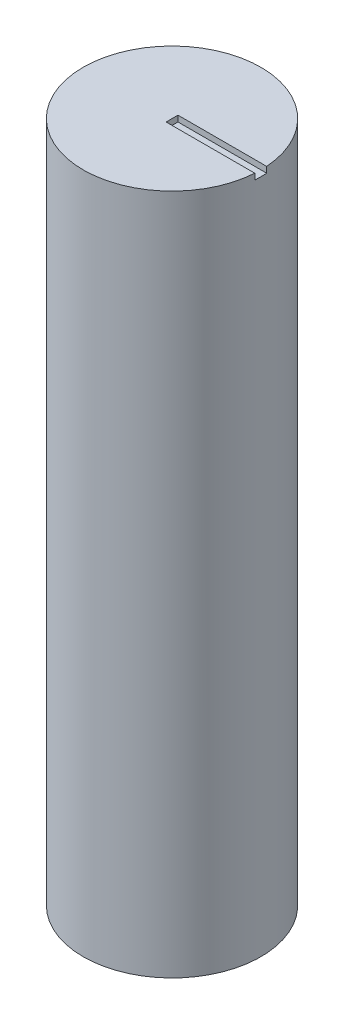
ISO-10303-21;
HEADER;
FILE_DESCRIPTION(('STEP AP214'),'2;1');
FILE_NAME('part.step','',(''),(''),'','','');
FILE_SCHEMA(('AUTOMOTIVE_DESIGN { 1 0 10303 214 1 1 1 1 }'));
ENDSEC;
DATA;
#1=APPLICATION_CONTEXT('core data for automotive mechanical design processes');
#2=APPLICATION_PROTOCOL_DEFINITION('international standard','automotive_design',2000,#1);
#3=PRODUCT_CONTEXT('',#1,'mechanical');
#4=PRODUCT('Part','Part','',(#3));
#5=PRODUCT_RELATED_PRODUCT_CATEGORY('part','',(#4));
#6=PRODUCT_DEFINITION_FORMATION('','',#4);
#7=PRODUCT_DEFINITION_CONTEXT('part definition',#1,'design');
#8=PRODUCT_DEFINITION('design','',#6,#7);
#9=PRODUCT_DEFINITION_SHAPE('','',#8);
#10=(LENGTH_UNIT() NAMED_UNIT(*) SI_UNIT(.MILLI.,.METRE.));
#11=(NAMED_UNIT(*) PLANE_ANGLE_UNIT() SI_UNIT($,.RADIAN.));
#12=(NAMED_UNIT(*) SI_UNIT($,.STERADIAN.) SOLID_ANGLE_UNIT());
#13=UNCERTAINTY_MEASURE_WITH_UNIT(LENGTH_MEASURE(1.E-05),#10,'distance_accuracy_value','');
#14=(GEOMETRIC_REPRESENTATION_CONTEXT(3) GLOBAL_UNCERTAINTY_ASSIGNED_CONTEXT((#13)) GLOBAL_UNIT_ASSIGNED_CONTEXT((#10,
#11,#12)) REPRESENTATION_CONTEXT('',''));
#15=CARTESIAN_POINT('',(0.,0.,0.));
#16=DIRECTION('',(0.,0.,1.));
#17=DIRECTION('',(1.,0.,0.));
#18=AXIS2_PLACEMENT_3D('',#15,#16,#17);
#19=CARTESIAN_POINT('',(0.,11.5,0.));
#20=DIRECTION('',(0.,-1.,0.));
#21=DIRECTION('',(0.,0.,-1.));
#22=AXIS2_PLACEMENT_3D('',#19,#20,#21);
#23=CYLINDRICAL_SURFACE('',#22,1.5);
#24=CARTESIAN_POINT('',(0.,0.,0.));
#25=DIRECTION('',(0.,1.,0.));
#26=DIRECTION('',(0.,0.,1.));
#27=AXIS2_PLACEMENT_3D('',#24,#25,#26);
#28=CIRCLE('',#27,1.5);
#29=CARTESIAN_POINT('',(0.,0.,1.5));
#30=VERTEX_POINT('',#29);
#31=EDGE_CURVE('E128',#30,#30,#28,.T.);
#32=ORIENTED_EDGE('',*,*,#31,.T.);
#33=EDGE_LOOP('',(#32));
#34=FACE_BOUND('',#33,.T.);
#35=DIRECTION('',(0.,-1.,0.));
#36=VECTOR('',#35,1.);
#37=CARTESIAN_POINT('',(1.49665208374926,11.5,0.100162568901819));
#38=LINE('',#37,#36);
#39=CARTESIAN_POINT('',(1.49665208374926,11.5,0.100162568901819));
#40=VERTEX_POINT('',#39);
#41=CARTESIAN_POINT('',(1.49666014615279,11.4,0.100084000673188));
#42=VERTEX_POINT('',#41);
#43=EDGE_CURVE('E110',#40,#42,#38,.T.);
#44=ORIENTED_EDGE('',*,*,#43,.F.);
#45=CARTESIAN_POINT('',(0.,11.5,0.));
#46=DIRECTION('',(0.,1.,0.));
#47=DIRECTION('',(0.,0.,1.));
#48=AXIS2_PLACEMENT_3D('',#45,#46,#47);
#49=CIRCLE('',#48,1.5);
#50=CARTESIAN_POINT('',(1.49666295470958,11.5,-0.1));
#51=VERTEX_POINT('',#50);
#52=EDGE_CURVE('E115',#51,#40,#49,.T.);
#53=ORIENTED_EDGE('',*,*,#52,.F.);
#54=DIRECTION('',(0.,-1.,0.));
#55=VECTOR('',#54,1.);
#56=CARTESIAN_POINT('',(1.49666295470958,11.5,-0.1));
#57=LINE('',#56,#55);
#58=CARTESIAN_POINT('',(1.49666295470958,11.4,-0.1));
#59=VERTEX_POINT('',#58);
#60=EDGE_CURVE('E131',#59,#51,#57,.F.);
#61=ORIENTED_EDGE('',*,*,#60,.F.);
#62=CARTESIAN_POINT('',(0.,11.4,0.));
#63=DIRECTION('',(0.,-1.,0.));
#64=DIRECTION('',(0.997775303139718,0.,-0.0666666666666667));
#65=AXIS2_PLACEMENT_3D('',#62,#63,#64);
#66=CIRCLE('',#65,1.5);
#67=EDGE_CURVE('E152',#59,#42,#66,.T.);
#68=ORIENTED_EDGE('',*,*,#67,.T.);
#69=EDGE_LOOP('',(#44,#53,#61,#68));
#70=FACE_BOUND('',#69,.T.);
#71=ADVANCED_FACE('F43',(#34,#70),#23,.T.);
#72=CARTESIAN_POINT('',(0.,11.5,0.));
#73=DIRECTION('',(0.,1.,0.));
#74=DIRECTION('',(0.,0.,1.));
#75=AXIS2_PLACEMENT_3D('',#72,#73,#74);
#76=PLANE('',#75);
#77=DIRECTION('',(1.,0.,0.));
#78=VECTOR('',#77,1.);
#79=CARTESIAN_POINT('',(1.47043039982424,11.5,0.100162568901819));
#80=LINE('',#79,#78);
#81=CARTESIAN_POINT('',(1.47043039982424,11.5,0.100162568901819));
#82=VERTEX_POINT('',#81);
#83=EDGE_CURVE('E101',#82,#40,#80,.T.);
#84=ORIENTED_EDGE('',*,*,#83,.F.);
#85=DIRECTION('',(0.,0.,1.));
#86=VECTOR('',#85,1.);
#87=CARTESIAN_POINT('',(1.47043039982424,11.5,-0.1));
#88=LINE('',#87,#86);
#89=CARTESIAN_POINT('',(1.47043039982424,11.5,0.1));
#90=VERTEX_POINT('',#89);
#91=EDGE_CURVE('E92',#90,#82,#88,.T.);
#92=ORIENTED_EDGE('',*,*,#91,.F.);
#93=DIRECTION('',(1.,0.,0.));
#94=VECTOR('',#93,1.);
#95=CARTESIAN_POINT('',(0.,11.5,0.1));
#96=LINE('',#95,#94);
#97=CARTESIAN_POINT('',(0.,11.5,0.1));
#98=VERTEX_POINT('',#97);
#99=EDGE_CURVE('E207',#98,#90,#96,.T.);
#100=ORIENTED_EDGE('',*,*,#99,.F.);
#101=DIRECTION('',(0.,0.,1.));
#102=VECTOR('',#101,1.);
#103=CARTESIAN_POINT('',(0.,11.5,0.));
#104=LINE('',#103,#102);
#105=CARTESIAN_POINT('',(0.,11.5,-0.1));
#106=VERTEX_POINT('',#105);
#107=EDGE_CURVE('E162',#106,#98,#104,.T.);
#108=ORIENTED_EDGE('',*,*,#107,.F.);
#109=DIRECTION('',(1.,0.,0.));
#110=VECTOR('',#109,1.);
#111=CARTESIAN_POINT('',(0.,11.5,-0.1));
#112=LINE('',#111,#110);
#113=EDGE_CURVE('E197',#106,#51,#112,.T.);
#114=ORIENTED_EDGE('',*,*,#113,.T.);
#115=ORIENTED_EDGE('',*,*,#52,.T.);
#116=EDGE_LOOP('',(#84,#92,#100,#108,#114,#115));
#117=FACE_BOUND('',#116,.T.);
#118=ADVANCED_FACE('F113',(#117),#76,.T.);
#119=CARTESIAN_POINT('',(0.,11.4,0.1));
#120=DIRECTION('',(0.,0.,1.));
#121=DIRECTION('',(1.,0.,0.));
#122=AXIS2_PLACEMENT_3D('',#119,#120,#121);
#123=PLANE('',#122);
#124=DIRECTION('',(0.,1.,0.));
#125=VECTOR('',#124,1.);
#126=CARTESIAN_POINT('',(1.47043039982424,11.4,0.1));
#127=LINE('',#126,#125);
#128=CARTESIAN_POINT('',(1.47043039982424,11.4,0.1));
#129=VERTEX_POINT('',#128);
#130=EDGE_CURVE('E11',#129,#90,#127,.T.);
#131=ORIENTED_EDGE('',*,*,#130,.F.);
#132=DIRECTION('',(1.,0.,0.));
#133=VECTOR('',#132,1.);
#134=CARTESIAN_POINT('',(0.,11.4,0.1));
#135=LINE('',#134,#133);
#136=CARTESIAN_POINT('',(0.,11.4,0.1));
#137=VERTEX_POINT('',#136);
#138=EDGE_CURVE('E158',#137,#129,#135,.T.);
#139=ORIENTED_EDGE('',*,*,#138,.F.);
#140=DIRECTION('',(0.,1.,0.));
#141=VECTOR('',#140,1.);
#142=CARTESIAN_POINT('',(0.,11.4,0.1));
#143=LINE('',#142,#141);
#144=EDGE_CURVE('E53',#137,#98,#143,.T.);
#145=ORIENTED_EDGE('',*,*,#144,.T.);
#146=ORIENTED_EDGE('',*,*,#99,.T.);
#147=EDGE_LOOP('',(#131,#139,#145,#146));
#148=FACE_BOUND('',#147,.T.);
#149=ADVANCED_FACE('F184',(#148),#123,.F.);
#150=CARTESIAN_POINT('',(0.,0.,0.));
#151=DIRECTION('',(0.,1.,0.));
#152=DIRECTION('',(0.,0.,1.));
#153=AXIS2_PLACEMENT_3D('',#150,#151,#152);
#154=PLANE('',#153);
#155=ORIENTED_EDGE('',*,*,#31,.F.);
#156=EDGE_LOOP('',(#155));
#157=FACE_BOUND('',#156,.T.);
#158=ADVANCED_FACE('F191',(#157),#154,.F.);
#159=CARTESIAN_POINT('',(0.,11.4,-0.1));
#160=DIRECTION('',(0.,0.,1.));
#161=DIRECTION('',(1.,0.,0.));
#162=AXIS2_PLACEMENT_3D('',#159,#160,#161);
#163=PLANE('',#162);
#164=ORIENTED_EDGE('',*,*,#60,.T.);
#165=ORIENTED_EDGE('',*,*,#113,.F.);
#166=DIRECTION('',(0.,1.,0.));
#167=VECTOR('',#166,1.);
#168=CARTESIAN_POINT('',(0.,11.4,-0.1));
#169=LINE('',#168,#167);
#170=CARTESIAN_POINT('',(0.,11.4,-0.1));
#171=VERTEX_POINT('',#170);
#172=EDGE_CURVE('E206',#171,#106,#169,.T.);
#173=ORIENTED_EDGE('',*,*,#172,.F.);
#174=DIRECTION('',(1.,0.,0.));
#175=VECTOR('',#174,1.);
#176=CARTESIAN_POINT('',(0.,11.4,-0.1));
#177=LINE('',#176,#175);
#178=EDGE_CURVE('E136',#171,#59,#177,.T.);
#179=ORIENTED_EDGE('',*,*,#178,.T.);
#180=EDGE_LOOP('',(#164,#165,#173,#179));
#181=FACE_BOUND('',#180,.T.);
#182=ADVANCED_FACE('F182',(#181),#163,.T.);
#183=CARTESIAN_POINT('',(0.,11.4,0.));
#184=DIRECTION('',(0.,1.,0.));
#185=DIRECTION('',(0.,0.,1.));
#186=AXIS2_PLACEMENT_3D('',#183,#184,#185);
#187=PLANE('',#186);
#188=ORIENTED_EDGE('',*,*,#67,.F.);
#189=ORIENTED_EDGE('',*,*,#178,.F.);
#190=DIRECTION('',(0.,0.,1.));
#191=VECTOR('',#190,1.);
#192=CARTESIAN_POINT('',(0.,11.4,0.));
#193=LINE('',#192,#191);
#194=EDGE_CURVE('E135',#171,#137,#193,.T.);
#195=ORIENTED_EDGE('',*,*,#194,.T.);
#196=ORIENTED_EDGE('',*,*,#138,.T.);
#197=DIRECTION('',(0.,0.,1.));
#198=VECTOR('',#197,1.);
#199=CARTESIAN_POINT('',(1.47043039982424,11.4,-0.1));
#200=LINE('',#199,#198);
#201=CARTESIAN_POINT('',(1.47043039982424,11.4,0.100162568901819));
#202=VERTEX_POINT('',#201);
#203=EDGE_CURVE('E119',#129,#202,#200,.T.);
#204=ORIENTED_EDGE('',*,*,#203,.T.);
#205=DIRECTION('',(1.,0.,0.));
#206=VECTOR('',#205,1.);
#207=CARTESIAN_POINT('',(1.47043039982424,11.4,0.100162568901819));
#208=LINE('',#207,#206);
#209=EDGE_CURVE('E102',#202,#42,#208,.T.);
#210=ORIENTED_EDGE('',*,*,#209,.T.);
#211=EDGE_LOOP('',(#188,#189,#195,#196,#204,#210));
#212=FACE_BOUND('',#211,.T.);
#213=ADVANCED_FACE('F172',(#212),#187,.T.);
#214=CARTESIAN_POINT('',(0.,11.4,0.));
#215=DIRECTION('',(-1.,0.,0.));
#216=DIRECTION('',(0.,0.,1.));
#217=AXIS2_PLACEMENT_3D('',#214,#215,#216);
#218=PLANE('',#217);
#219=ORIENTED_EDGE('',*,*,#107,.T.);
#220=ORIENTED_EDGE('',*,*,#144,.F.);
#221=ORIENTED_EDGE('',*,*,#194,.F.);
#222=ORIENTED_EDGE('',*,*,#172,.T.);
#223=EDGE_LOOP('',(#219,#220,#221,#222));
#224=FACE_BOUND('',#223,.T.);
#225=ADVANCED_FACE('F181',(#224),#218,.F.);
#226=CARTESIAN_POINT('',(1.47043039982424,11.5,0.100162568901819));
#227=DIRECTION('',(0.,0.,-1.));
#228=DIRECTION('',(-1.,0.,0.));
#229=AXIS2_PLACEMENT_3D('',#226,#227,#228);
#230=PLANE('',#229);
#231=ORIENTED_EDGE('',*,*,#43,.T.);
#232=ORIENTED_EDGE('',*,*,#209,.F.);
#233=DIRECTION('',(0.,-1.,0.));
#234=VECTOR('',#233,1.);
#235=CARTESIAN_POINT('',(1.47043039982424,11.5,0.100162568901819));
#236=LINE('',#235,#234);
#237=EDGE_CURVE('E95',#82,#202,#236,.T.);
#238=ORIENTED_EDGE('',*,*,#237,.F.);
#239=ORIENTED_EDGE('',*,*,#83,.T.);
#240=EDGE_LOOP('',(#231,#232,#238,#239));
#241=FACE_BOUND('',#240,.T.);
#242=ADVANCED_FACE('F107',(#241),#230,.T.);
#243=CARTESIAN_POINT('',(1.47043039982424,11.5,-0.1));
#244=DIRECTION('',(1.,0.,0.));
#245=DIRECTION('',(0.,0.,-1.));
#246=AXIS2_PLACEMENT_3D('',#243,#244,#245);
#247=PLANE('',#246);
#248=ORIENTED_EDGE('',*,*,#130,.T.);
#249=ORIENTED_EDGE('',*,*,#91,.T.);
#250=ORIENTED_EDGE('',*,*,#237,.T.);
#251=ORIENTED_EDGE('',*,*,#203,.F.);
#252=EDGE_LOOP('',(#248,#249,#250,#251));
#253=FACE_BOUND('',#252,.T.);
#254=ADVANCED_FACE('F94',(#253),#247,.T.);
#255=CLOSED_SHELL('',(#71,#118,#149,#158,#182,#213,#225,#242,#254));
#256=MANIFOLD_SOLID_BREP('B2',#255);
#257=ADVANCED_BREP_SHAPE_REPRESENTATION('',(#18,#256),#14);
#258=SHAPE_DEFINITION_REPRESENTATION(#9,#257);
ENDSEC;
END-ISO-10303-21;
